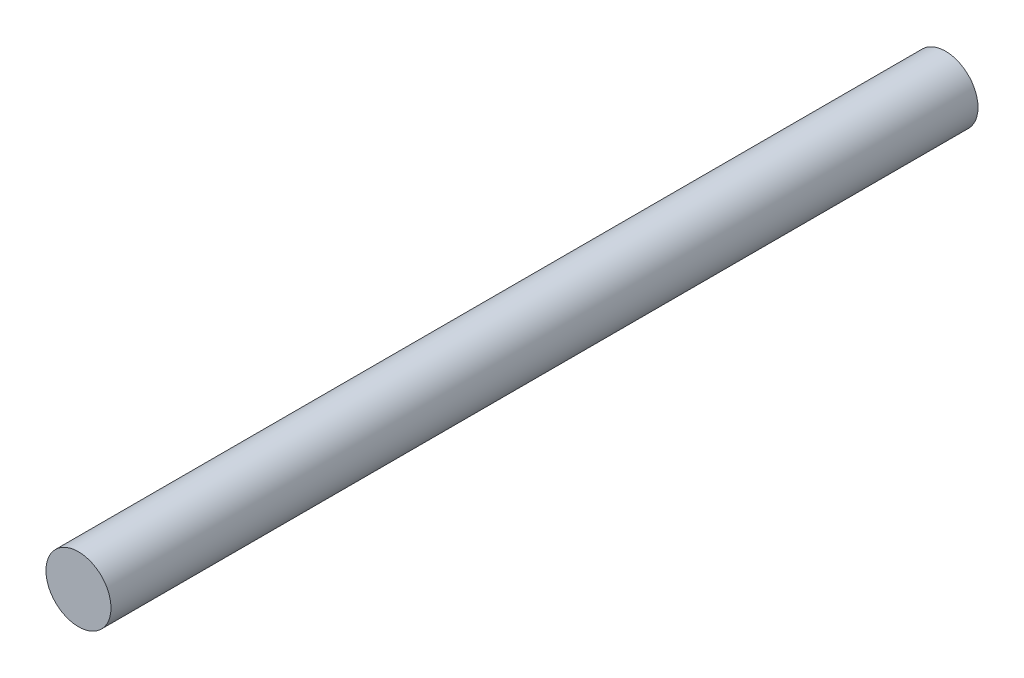
ISO-10303-21;
HEADER;
FILE_DESCRIPTION(('STEP AP214'),'2;1');
FILE_NAME('part.step','',(''),(''),'','','');
FILE_SCHEMA(('AUTOMOTIVE_DESIGN { 1 0 10303 214 1 1 1 1 }'));
ENDSEC;
DATA;
#1=APPLICATION_CONTEXT('core data for automotive mechanical design processes');
#2=APPLICATION_PROTOCOL_DEFINITION('international standard','automotive_design',2000,#1);
#3=PRODUCT_CONTEXT('',#1,'mechanical');
#4=PRODUCT('Part','Part','',(#3));
#5=PRODUCT_RELATED_PRODUCT_CATEGORY('part','',(#4));
#6=PRODUCT_DEFINITION_FORMATION('','',#4);
#7=PRODUCT_DEFINITION_CONTEXT('part definition',#1,'design');
#8=PRODUCT_DEFINITION('design','',#6,#7);
#9=PRODUCT_DEFINITION_SHAPE('','',#8);
#10=(LENGTH_UNIT() NAMED_UNIT(*) SI_UNIT(.MILLI.,.METRE.));
#11=(NAMED_UNIT(*) PLANE_ANGLE_UNIT() SI_UNIT($,.RADIAN.));
#12=(NAMED_UNIT(*) SI_UNIT($,.STERADIAN.) SOLID_ANGLE_UNIT());
#13=UNCERTAINTY_MEASURE_WITH_UNIT(LENGTH_MEASURE(1.E-05),#10,'distance_accuracy_value','');
#14=(GEOMETRIC_REPRESENTATION_CONTEXT(3) GLOBAL_UNCERTAINTY_ASSIGNED_CONTEXT((#13)) GLOBAL_UNIT_ASSIGNED_CONTEXT((#10,
#11,#12)) REPRESENTATION_CONTEXT('',''));
#15=CARTESIAN_POINT('',(0.,0.,0.));
#16=DIRECTION('',(0.,0.,1.));
#17=DIRECTION('',(1.,0.,0.));
#18=AXIS2_PLACEMENT_3D('',#15,#16,#17);
#19=CARTESIAN_POINT('',(0.,0.,40.));
#20=DIRECTION('',(0.,0.,-1.));
#21=DIRECTION('',(-1.,0.,0.));
#22=AXIS2_PLACEMENT_3D('',#19,#20,#21);
#23=CYLINDRICAL_SURFACE('',#22,1.5);
#24=CARTESIAN_POINT('',(0.,0.,40.));
#25=DIRECTION('',(0.,0.,1.));
#26=DIRECTION('',(1.,0.,0.));
#27=AXIS2_PLACEMENT_3D('',#24,#25,#26);
#28=CIRCLE('',#27,1.5);
#29=CARTESIAN_POINT('',(1.5,0.,40.));
#30=VERTEX_POINT('',#29);
#31=EDGE_CURVE('E10',#30,#30,#28,.T.);
#32=ORIENTED_EDGE('',*,*,#31,.F.);
#33=EDGE_LOOP('',(#32));
#34=FACE_BOUND('',#33,.T.);
#35=CARTESIAN_POINT('',(0.,0.,0.));
#36=DIRECTION('',(0.,0.,1.));
#37=DIRECTION('',(1.,0.,0.));
#38=AXIS2_PLACEMENT_3D('',#35,#36,#37);
#39=CIRCLE('',#38,1.5);
#40=CARTESIAN_POINT('',(1.5,0.,0.));
#41=VERTEX_POINT('',#40);
#42=EDGE_CURVE('E34',#41,#41,#39,.T.);
#43=ORIENTED_EDGE('',*,*,#42,.T.);
#44=EDGE_LOOP('',(#43));
#45=FACE_BOUND('',#44,.T.);
#46=ADVANCED_FACE('F31',(#34,#45),#23,.T.);
#47=CARTESIAN_POINT('',(0.,0.,40.));
#48=DIRECTION('',(0.,0.,1.));
#49=DIRECTION('',(1.,0.,0.));
#50=AXIS2_PLACEMENT_3D('',#47,#48,#49);
#51=PLANE('',#50);
#52=ORIENTED_EDGE('',*,*,#31,.T.);
#53=EDGE_LOOP('',(#52));
#54=FACE_BOUND('',#53,.T.);
#55=ADVANCED_FACE('F46',(#54),#51,.T.);
#56=CARTESIAN_POINT('',(0.,0.,0.));
#57=DIRECTION('',(0.,0.,1.));
#58=DIRECTION('',(1.,0.,0.));
#59=AXIS2_PLACEMENT_3D('',#56,#57,#58);
#60=PLANE('',#59);
#61=ORIENTED_EDGE('',*,*,#42,.F.);
#62=EDGE_LOOP('',(#61));
#63=FACE_BOUND('',#62,.T.);
#64=ADVANCED_FACE('F44',(#63),#60,.F.);
#65=CLOSED_SHELL('',(#46,#55,#64));
#66=MANIFOLD_SOLID_BREP('B2',#65);
#67=ADVANCED_BREP_SHAPE_REPRESENTATION('',(#18,#66),#14);
#68=SHAPE_DEFINITION_REPRESENTATION(#9,#67);
ENDSEC;
END-ISO-10303-21;
